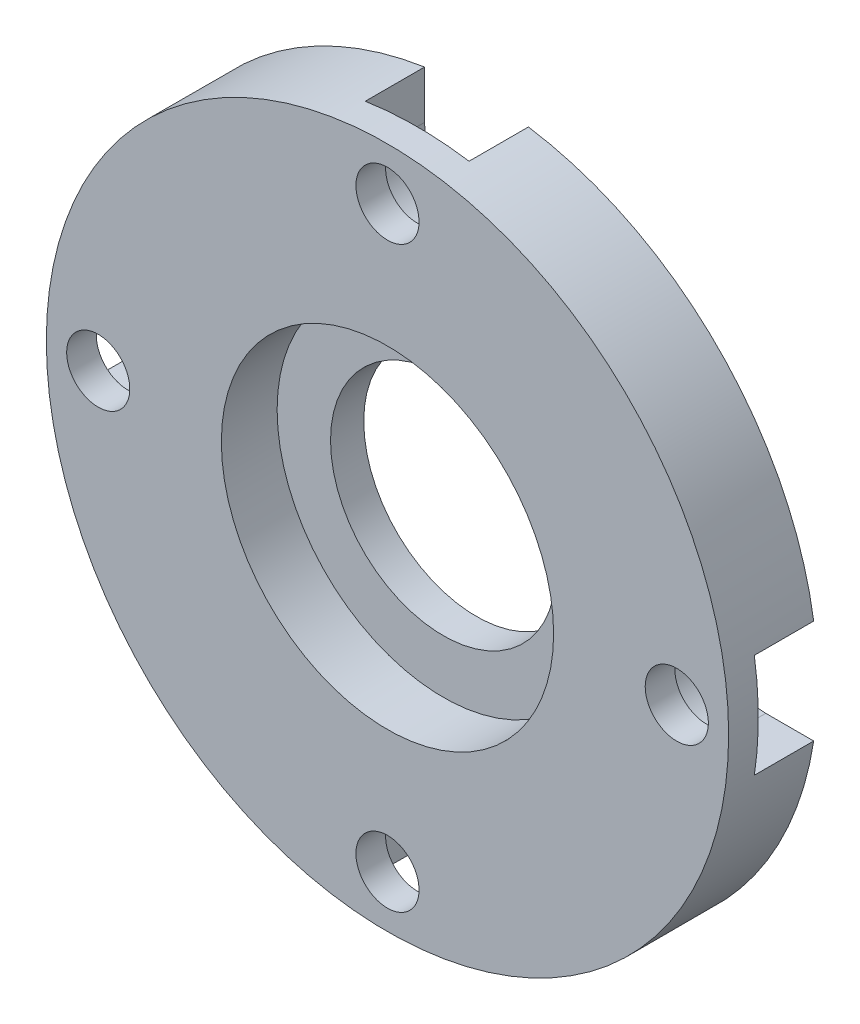
ISO-10303-21;
HEADER;
FILE_DESCRIPTION(('STEP AP214'),'2;1');
FILE_NAME('part.step','',(''),(''),'','','');
FILE_SCHEMA(('AUTOMOTIVE_DESIGN { 1 0 10303 214 1 1 1 1 }'));
ENDSEC;
DATA;
#1=APPLICATION_CONTEXT('core data for automotive mechanical design processes');
#2=APPLICATION_PROTOCOL_DEFINITION('international standard','automotive_design',2000,#1);
#3=PRODUCT_CONTEXT('',#1,'mechanical');
#4=PRODUCT('Part','Part','',(#3));
#5=PRODUCT_RELATED_PRODUCT_CATEGORY('part','',(#4));
#6=PRODUCT_DEFINITION_FORMATION('','',#4);
#7=PRODUCT_DEFINITION_CONTEXT('part definition',#1,'design');
#8=PRODUCT_DEFINITION('design','',#6,#7);
#9=PRODUCT_DEFINITION_SHAPE('','',#8);
#10=(LENGTH_UNIT() NAMED_UNIT(*) SI_UNIT(.MILLI.,.METRE.));
#11=(NAMED_UNIT(*) PLANE_ANGLE_UNIT() SI_UNIT($,.RADIAN.));
#12=(NAMED_UNIT(*) SI_UNIT($,.STERADIAN.) SOLID_ANGLE_UNIT());
#13=UNCERTAINTY_MEASURE_WITH_UNIT(LENGTH_MEASURE(1.E-05),#10,'distance_accuracy_value','');
#14=(GEOMETRIC_REPRESENTATION_CONTEXT(3) GLOBAL_UNCERTAINTY_ASSIGNED_CONTEXT((#13)) GLOBAL_UNIT_ASSIGNED_CONTEXT((#10,
#11,#12)) REPRESENTATION_CONTEXT('',''));
#15=CARTESIAN_POINT('',(0.,0.,0.));
#16=DIRECTION('',(0.,0.,1.));
#17=DIRECTION('',(1.,0.,0.));
#18=AXIS2_PLACEMENT_3D('',#15,#16,#17);
#19=CARTESIAN_POINT('',(30.95752,0.,-93.345));
#20=DIRECTION('',(0.,0.,-1.));
#21=DIRECTION('',(-1.,0.,0.));
#22=AXIS2_PLACEMENT_3D('',#19,#20,#21);
#23=CYLINDRICAL_SURFACE('',#22,5.55625);
#24=DIRECTION('',(0.,0.,-1.));
#25=VECTOR('',#24,1.);
#26=CARTESIAN_POINT('',(30.9575199999996,-5.55625000000041,-74.1961658245761));
#27=LINE('',#26,#25);
#28=CARTESIAN_POINT('',(30.9575199999996,-5.55625000000041,-86.995));
#29=VERTEX_POINT('',#28);
#30=CARTESIAN_POINT('',(30.9575199999996,-5.55625,-93.345));
#31=VERTEX_POINT('',#30);
#32=EDGE_CURVE('E278',#29,#31,#27,.T.);
#33=ORIENTED_EDGE('',*,*,#32,.T.);
#34=CARTESIAN_POINT('',(30.95752,0.,-93.345));
#35=DIRECTION('',(0.,0.,-1.));
#36=DIRECTION('',(-1.,0.,0.));
#37=AXIS2_PLACEMENT_3D('',#34,#35,#36);
#38=CIRCLE('',#37,5.55625);
#39=CARTESIAN_POINT('',(30.9575199999996,5.55624999999954,-93.345));
#40=VERTEX_POINT('',#39);
#41=EDGE_CURVE('E211',#31,#40,#38,.T.);
#42=ORIENTED_EDGE('',*,*,#41,.T.);
#43=DIRECTION('',(0.,0.,-1.));
#44=VECTOR('',#43,1.);
#45=CARTESIAN_POINT('',(30.9575199999996,5.55624999999954,-74.1961658245761));
#46=LINE('',#45,#44);
#47=CARTESIAN_POINT('',(30.9575199999996,5.55625,-86.995));
#48=VERTEX_POINT('',#47);
#49=EDGE_CURVE('E276',#48,#40,#46,.T.);
#50=ORIENTED_EDGE('',*,*,#49,.F.);
#51=CARTESIAN_POINT('',(30.95752,0.,-86.995));
#52=DIRECTION('',(0.,0.,-1.));
#53=DIRECTION('',(-1.,0.,0.));
#54=AXIS2_PLACEMENT_3D('',#51,#52,#53);
#55=CIRCLE('',#54,5.55625);
#56=EDGE_CURVE('E214',#29,#48,#55,.T.);
#57=ORIENTED_EDGE('',*,*,#56,.F.);
#58=EDGE_LOOP('',(#33,#42,#50,#57));
#59=FACE_BOUND('',#58,.T.);
#60=ADVANCED_FACE('F33',(#59),#23,.F.);
#61=CARTESIAN_POINT('',(0.,-30.95752,-93.345));
#62=DIRECTION('',(0.,0.,-1.));
#63=DIRECTION('',(-1.,0.,0.));
#64=AXIS2_PLACEMENT_3D('',#61,#62,#63);
#65=CYLINDRICAL_SURFACE('',#64,5.55625);
#66=DIRECTION('',(0.,0.,-1.));
#67=VECTOR('',#66,1.);
#68=CARTESIAN_POINT('',(-5.55625000000084,-30.95752,-74.1961658245761));
#69=LINE('',#68,#67);
#70=CARTESIAN_POINT('',(-5.55625000000084,-30.95752,-86.995));
#71=VERTEX_POINT('',#70);
#72=CARTESIAN_POINT('',(-5.55625,-30.95752,-93.345));
#73=VERTEX_POINT('',#72);
#74=EDGE_CURVE('E255',#71,#73,#69,.T.);
#75=ORIENTED_EDGE('',*,*,#74,.T.);
#76=CARTESIAN_POINT('',(0.,-30.95752,-93.345));
#77=DIRECTION('',(0.,0.,-1.));
#78=DIRECTION('',(-1.,0.,0.));
#79=AXIS2_PLACEMENT_3D('',#76,#77,#78);
#80=CIRCLE('',#79,5.55625);
#81=CARTESIAN_POINT('',(5.55624999999911,-30.95752,-93.345));
#82=VERTEX_POINT('',#81);
#83=EDGE_CURVE('E177',#73,#82,#80,.T.);
#84=ORIENTED_EDGE('',*,*,#83,.T.);
#85=DIRECTION('',(0.,0.,-1.));
#86=VECTOR('',#85,1.);
#87=CARTESIAN_POINT('',(5.55624999999911,-30.95752,-74.1961658245761));
#88=LINE('',#87,#86);
#89=CARTESIAN_POINT('',(5.55625,-30.95752,-86.995));
#90=VERTEX_POINT('',#89);
#91=EDGE_CURVE('E253',#90,#82,#88,.T.);
#92=ORIENTED_EDGE('',*,*,#91,.F.);
#93=CARTESIAN_POINT('',(0.,-30.95752,-86.995));
#94=DIRECTION('',(0.,0.,-1.));
#95=DIRECTION('',(-1.,0.,0.));
#96=AXIS2_PLACEMENT_3D('',#93,#94,#95);
#97=CIRCLE('',#96,5.55625);
#98=EDGE_CURVE('E202',#71,#90,#97,.T.);
#99=ORIENTED_EDGE('',*,*,#98,.F.);
#100=EDGE_LOOP('',(#75,#84,#92,#99));
#101=FACE_BOUND('',#100,.T.);
#102=ADVANCED_FACE('F251',(#101),#65,.F.);
#103=CARTESIAN_POINT('',(-30.95752,0.,-93.345));
#104=DIRECTION('',(0.,0.,-1.));
#105=DIRECTION('',(-1.,0.,0.));
#106=AXIS2_PLACEMENT_3D('',#103,#104,#105);
#107=CYLINDRICAL_SURFACE('',#106,5.55625);
#108=DIRECTION('',(0.,0.,-1.));
#109=VECTOR('',#108,1.);
#110=CARTESIAN_POINT('',(-30.95752,5.55624999999987,-74.1961658245761));
#111=LINE('',#110,#109);
#112=CARTESIAN_POINT('',(-30.95752,5.55624999999987,-86.995));
#113=VERTEX_POINT('',#112);
#114=CARTESIAN_POINT('',(-30.95752,5.55625,-93.345));
#115=VERTEX_POINT('',#114);
#116=EDGE_CURVE('E269',#113,#115,#111,.T.);
#117=ORIENTED_EDGE('',*,*,#116,.T.);
#118=CARTESIAN_POINT('',(-30.95752,0.,-93.345));
#119=DIRECTION('',(0.,0.,-1.));
#120=DIRECTION('',(-1.,0.,0.));
#121=AXIS2_PLACEMENT_3D('',#118,#119,#120);
#122=CIRCLE('',#121,5.55625);
#123=CARTESIAN_POINT('',(-30.95752,-5.55625000000008,-93.345));
#124=VERTEX_POINT('',#123);
#125=EDGE_CURVE('E190',#115,#124,#122,.T.);
#126=ORIENTED_EDGE('',*,*,#125,.T.);
#127=DIRECTION('',(0.,0.,-1.));
#128=VECTOR('',#127,1.);
#129=CARTESIAN_POINT('',(-30.95752,-5.55625000000008,-74.1961658245761));
#130=LINE('',#129,#128);
#131=CARTESIAN_POINT('',(-30.95752,-5.55625,-86.995));
#132=VERTEX_POINT('',#131);
#133=EDGE_CURVE('E267',#132,#124,#130,.T.);
#134=ORIENTED_EDGE('',*,*,#133,.F.);
#135=CARTESIAN_POINT('',(-30.95752,0.,-86.995));
#136=DIRECTION('',(0.,0.,-1.));
#137=DIRECTION('',(-1.,0.,0.));
#138=AXIS2_PLACEMENT_3D('',#135,#136,#137);
#139=CIRCLE('',#138,5.55625);
#140=EDGE_CURVE('E193',#113,#132,#139,.T.);
#141=ORIENTED_EDGE('',*,*,#140,.F.);
#142=EDGE_LOOP('',(#117,#126,#134,#141));
#143=FACE_BOUND('',#142,.T.);
#144=ADVANCED_FACE('F361',(#143),#107,.F.);
#145=CARTESIAN_POINT('',(0.,0.,-141.552259200278));
#146=DIRECTION('',(0.,0.,-1.));
#147=DIRECTION('',(-1.,0.,0.));
#148=AXIS2_PLACEMENT_3D('',#145,#146,#147);
#149=CYLINDRICAL_SURFACE('',#148,12.0649999999755);
#150=CARTESIAN_POINT('',(0.,0.,-89.789));
#151=DIRECTION('',(0.,0.,-1.));
#152=DIRECTION('',(-1.,0.,0.));
#153=AXIS2_PLACEMENT_3D('',#150,#151,#152);
#154=CIRCLE('',#153,12.0649999999755);
#155=CARTESIAN_POINT('',(-12.0649999999755,0.,-89.789));
#156=VERTEX_POINT('',#155);
#157=EDGE_CURVE('E239',#156,#156,#154,.T.);
#158=ORIENTED_EDGE('',*,*,#157,.F.);
#159=EDGE_LOOP('',(#158));
#160=FACE_BOUND('',#159,.T.);
#161=CARTESIAN_POINT('',(0.,0.,-93.345));
#162=DIRECTION('',(0.,0.,-1.));
#163=DIRECTION('',(-1.,0.,0.));
#164=AXIS2_PLACEMENT_3D('',#161,#162,#163);
#165=CIRCLE('',#164,12.0649999999755);
#166=CARTESIAN_POINT('',(-12.0649999999755,0.,-93.345));
#167=VERTEX_POINT('',#166);
#168=EDGE_CURVE('E223',#167,#167,#165,.T.);
#169=ORIENTED_EDGE('',*,*,#168,.T.);
#170=EDGE_LOOP('',(#169));
#171=FACE_BOUND('',#170,.T.);
#172=ADVANCED_FACE('F35',(#160,#171),#149,.F.);
#173=CARTESIAN_POINT('',(0.,12.0649999999755,-89.789));
#174=DIRECTION('',(0.,0.,-1.));
#175=DIRECTION('',(-1.,0.,0.));
#176=AXIS2_PLACEMENT_3D('',#173,#174,#175);
#177=PLANE('',#176);
#178=CARTESIAN_POINT('',(0.,0.,-89.789));
#179=DIRECTION('',(0.,0.,-1.));
#180=DIRECTION('',(-1.,0.,0.));
#181=AXIS2_PLACEMENT_3D('',#178,#179,#180);
#182=CIRCLE('',#181,17.7799999999755);
#183=CARTESIAN_POINT('',(-17.7799999999755,0.,-89.789));
#184=VERTEX_POINT('',#183);
#185=EDGE_CURVE('E236',#184,#184,#182,.T.);
#186=ORIENTED_EDGE('',*,*,#185,.F.);
#187=EDGE_LOOP('',(#186));
#188=FACE_BOUND('',#187,.T.);
#189=ORIENTED_EDGE('',*,*,#157,.T.);
#190=EDGE_LOOP('',(#189));
#191=FACE_BOUND('',#190,.T.);
#192=ADVANCED_FACE('F384',(#188,#191),#177,.F.);
#193=CARTESIAN_POINT('',(0.,0.,-141.552259200278));
#194=DIRECTION('',(0.,0.,-1.));
#195=DIRECTION('',(-1.,0.,0.));
#196=AXIS2_PLACEMENT_3D('',#193,#194,#195);
#197=CYLINDRICAL_SURFACE('',#196,17.7799999999755);
#198=CARTESIAN_POINT('',(0.,0.,-83.82));
#199=DIRECTION('',(0.,0.,-1.));
#200=DIRECTION('',(-1.,0.,0.));
#201=AXIS2_PLACEMENT_3D('',#198,#199,#200);
#202=CIRCLE('',#201,17.7799999999755);
#203=CARTESIAN_POINT('',(-17.7799999999755,0.,-83.82));
#204=VERTEX_POINT('',#203);
#205=EDGE_CURVE('E232',#204,#204,#202,.T.);
#206=ORIENTED_EDGE('',*,*,#205,.F.);
#207=EDGE_LOOP('',(#206));
#208=FACE_BOUND('',#207,.T.);
#209=ORIENTED_EDGE('',*,*,#185,.T.);
#210=EDGE_LOOP('',(#209));
#211=FACE_BOUND('',#210,.T.);
#212=ADVANCED_FACE('F381',(#208,#211),#197,.F.);
#213=CARTESIAN_POINT('',(0.,36.5125,-83.82));
#214=DIRECTION('',(0.,0.,1.));
#215=DIRECTION('',(1.,0.,0.));
#216=AXIS2_PLACEMENT_3D('',#213,#214,#215);
#217=PLANE('',#216);
#218=CARTESIAN_POINT('',(0.,30.95752,-83.82));
#219=DIRECTION('',(0.,0.,-1.));
#220=DIRECTION('',(-1.,0.,0.));
#221=AXIS2_PLACEMENT_3D('',#218,#219,#220);
#222=CIRCLE('',#221,3.3782);
#223=CARTESIAN_POINT('',(-3.3782,30.95752,-83.82));
#224=VERTEX_POINT('',#223);
#225=EDGE_CURVE('E187',#224,#224,#222,.T.);
#226=ORIENTED_EDGE('',*,*,#225,.T.);
#227=EDGE_LOOP('',(#226));
#228=FACE_BOUND('',#227,.T.);
#229=CARTESIAN_POINT('',(-30.95752,0.,-83.82));
#230=DIRECTION('',(0.,0.,-1.));
#231=DIRECTION('',(-1.,0.,0.));
#232=AXIS2_PLACEMENT_3D('',#229,#230,#231);
#233=CIRCLE('',#232,3.3782);
#234=CARTESIAN_POINT('',(-34.33572,0.,-83.82));
#235=VERTEX_POINT('',#234);
#236=EDGE_CURVE('E199',#235,#235,#233,.T.);
#237=ORIENTED_EDGE('',*,*,#236,.T.);
#238=EDGE_LOOP('',(#237));
#239=FACE_BOUND('',#238,.T.);
#240=CARTESIAN_POINT('',(0.,-30.95752,-83.82));
#241=DIRECTION('',(0.,0.,-1.));
#242=DIRECTION('',(-1.,0.,0.));
#243=AXIS2_PLACEMENT_3D('',#240,#241,#242);
#244=CIRCLE('',#243,3.3782);
#245=CARTESIAN_POINT('',(-3.3782,-30.95752,-83.82));
#246=VERTEX_POINT('',#245);
#247=EDGE_CURVE('E208',#246,#246,#244,.T.);
#248=ORIENTED_EDGE('',*,*,#247,.T.);
#249=EDGE_LOOP('',(#248));
#250=FACE_BOUND('',#249,.T.);
#251=CARTESIAN_POINT('',(30.95752,0.,-83.82));
#252=DIRECTION('',(0.,0.,-1.));
#253=DIRECTION('',(-1.,0.,0.));
#254=AXIS2_PLACEMENT_3D('',#251,#252,#253);
#255=CIRCLE('',#254,3.3782);
#256=CARTESIAN_POINT('',(27.57932,0.,-83.82));
#257=VERTEX_POINT('',#256);
#258=EDGE_CURVE('E220',#257,#257,#255,.T.);
#259=ORIENTED_EDGE('',*,*,#258,.T.);
#260=EDGE_LOOP('',(#259));
#261=FACE_BOUND('',#260,.T.);
#262=ORIENTED_EDGE('',*,*,#205,.T.);
#263=EDGE_LOOP('',(#262));
#264=FACE_BOUND('',#263,.T.);
#265=CARTESIAN_POINT('',(0.,0.,-83.82));
#266=DIRECTION('',(0.,0.,-1.));
#267=DIRECTION('',(-1.,0.,0.));
#268=AXIS2_PLACEMENT_3D('',#265,#266,#267);
#269=CIRCLE('',#268,36.5125);
#270=CARTESIAN_POINT('',(-36.5125,0.,-83.82));
#271=VERTEX_POINT('',#270);
#272=EDGE_CURVE('E229',#271,#271,#269,.T.);
#273=ORIENTED_EDGE('',*,*,#272,.F.);
#274=EDGE_LOOP('',(#273));
#275=FACE_BOUND('',#274,.T.);
#276=ADVANCED_FACE('F378',(#228,#239,#250,#261,#264,#275),#217,.T.);
#277=CARTESIAN_POINT('',(0.,0.,-141.552259200278));
#278=DIRECTION('',(0.,0.,-1.));
#279=DIRECTION('',(-1.,0.,0.));
#280=AXIS2_PLACEMENT_3D('',#277,#278,#279);
#281=CYLINDRICAL_SURFACE('',#280,36.5125);
#282=DIRECTION('',(0.,0.,-1.));
#283=VECTOR('',#282,1.);
#284=CARTESIAN_POINT('',(5.55624999999997,36.0872656513,-141.552259200278));
#285=LINE('',#284,#283);
#286=CARTESIAN_POINT('',(5.55624999999997,36.0872656513,-86.995));
#287=VERTEX_POINT('',#286);
#288=CARTESIAN_POINT('',(5.55624999999997,36.0872656513,-93.345));
#289=VERTEX_POINT('',#288);
#290=EDGE_CURVE('E288',#287,#289,#285,.T.);
#291=ORIENTED_EDGE('',*,*,#290,.F.);
#292=CARTESIAN_POINT('',(0.,0.,-86.995));
#293=DIRECTION('',(0.,0.,1.));
#294=DIRECTION('',(1.,0.,0.));
#295=AXIS2_PLACEMENT_3D('',#292,#293,#294);
#296=CIRCLE('',#295,36.5125);
#297=CARTESIAN_POINT('',(-5.55624999999997,36.0872656513,-86.995));
#298=VERTEX_POINT('',#297);
#299=EDGE_CURVE('E11',#298,#287,#296,.F.);
#300=ORIENTED_EDGE('',*,*,#299,.F.);
#301=DIRECTION('',(0.,0.,-1.));
#302=VECTOR('',#301,1.);
#303=CARTESIAN_POINT('',(-5.55624999999997,36.0872656513,-141.552259200278));
#304=LINE('',#303,#302);
#305=CARTESIAN_POINT('',(-5.55624999999997,36.0872656513,-93.345));
#306=VERTEX_POINT('',#305);
#307=EDGE_CURVE('E286',#306,#298,#304,.F.);
#308=ORIENTED_EDGE('',*,*,#307,.F.);
#309=CARTESIAN_POINT('',(0.,0.,-93.345));
#310=DIRECTION('',(0.,0.,-1.));
#311=DIRECTION('',(-1.,0.,0.));
#312=AXIS2_PLACEMENT_3D('',#309,#310,#311);
#313=CIRCLE('',#312,36.5125);
#314=CARTESIAN_POINT('',(-36.0872656513001,5.55624999999985,-93.345));
#315=VERTEX_POINT('',#314);
#316=EDGE_CURVE('E168',#315,#306,#313,.T.);
#317=ORIENTED_EDGE('',*,*,#316,.F.);
#318=DIRECTION('',(0.,0.,-1.));
#319=VECTOR('',#318,1.);
#320=CARTESIAN_POINT('',(-36.0872656513001,5.55624999999985,-141.552259200278));
#321=LINE('',#320,#319);
#322=CARTESIAN_POINT('',(-36.0872656513001,5.55624999999985,-86.995));
#323=VERTEX_POINT('',#322);
#324=EDGE_CURVE('E290',#323,#315,#321,.T.);
#325=ORIENTED_EDGE('',*,*,#324,.F.);
#326=CARTESIAN_POINT('',(0.,0.,-86.995));
#327=DIRECTION('',(0.,0.,1.));
#328=DIRECTION('',(1.,0.,0.));
#329=AXIS2_PLACEMENT_3D('',#326,#327,#328);
#330=CIRCLE('',#329,36.5125);
#331=CARTESIAN_POINT('',(-36.0872656513,-5.5562500000001,-86.995));
#332=VERTEX_POINT('',#331);
#333=EDGE_CURVE('E175',#332,#323,#330,.F.);
#334=ORIENTED_EDGE('',*,*,#333,.F.);
#335=DIRECTION('',(0.,0.,-1.));
#336=VECTOR('',#335,1.);
#337=CARTESIAN_POINT('',(-36.0872656513,-5.5562500000001,-141.552259200278));
#338=LINE('',#337,#336);
#339=CARTESIAN_POINT('',(-36.0872656513,-5.5562500000001,-93.345));
#340=VERTEX_POINT('',#339);
#341=EDGE_CURVE('E292',#340,#332,#338,.F.);
#342=ORIENTED_EDGE('',*,*,#341,.F.);
#343=CARTESIAN_POINT('',(-5.55625000000085,-36.0872656512999,-93.345));
#344=VERTEX_POINT('',#343);
#345=EDGE_CURVE('E228',#344,#340,#313,.T.);
#346=ORIENTED_EDGE('',*,*,#345,.F.);
#347=DIRECTION('',(0.,0.,-1.));
#348=VECTOR('',#347,1.);
#349=CARTESIAN_POINT('',(-5.55625000000085,-36.0872656512999,-141.552259200278));
#350=LINE('',#349,#348);
#351=CARTESIAN_POINT('',(-5.55625000000085,-36.0872656512999,-86.995));
#352=VERTEX_POINT('',#351);
#353=EDGE_CURVE('E295',#352,#344,#350,.T.);
#354=ORIENTED_EDGE('',*,*,#353,.F.);
#355=CARTESIAN_POINT('',(0.,0.,-86.995));
#356=DIRECTION('',(0.,0.,1.));
#357=DIRECTION('',(1.,0.,0.));
#358=AXIS2_PLACEMENT_3D('',#355,#356,#357);
#359=CIRCLE('',#358,36.5125);
#360=CARTESIAN_POINT('',(5.55624999999911,-36.0872656513002,-86.995));
#361=VERTEX_POINT('',#360);
#362=EDGE_CURVE('E244',#361,#352,#359,.F.);
#363=ORIENTED_EDGE('',*,*,#362,.F.);
#364=DIRECTION('',(0.,0.,-1.));
#365=VECTOR('',#364,1.);
#366=CARTESIAN_POINT('',(5.55624999999911,-36.0872656513002,-141.552259200278));
#367=LINE('',#366,#365);
#368=CARTESIAN_POINT('',(5.55624999999911,-36.0872656513002,-93.345));
#369=VERTEX_POINT('',#368);
#370=EDGE_CURVE('E297',#369,#361,#367,.F.);
#371=ORIENTED_EDGE('',*,*,#370,.F.);
#372=CARTESIAN_POINT('',(36.0872656513,-5.55625000000042,-93.345));
#373=VERTEX_POINT('',#372);
#374=EDGE_CURVE('E233',#373,#369,#313,.T.);
#375=ORIENTED_EDGE('',*,*,#374,.F.);
#376=DIRECTION('',(0.,0.,-1.));
#377=VECTOR('',#376,1.);
#378=CARTESIAN_POINT('',(36.0872656513,-5.55625000000042,-141.552259200278));
#379=LINE('',#378,#377);
#380=CARTESIAN_POINT('',(36.0872656513,-5.55625000000042,-86.995));
#381=VERTEX_POINT('',#380);
#382=EDGE_CURVE('E298',#381,#373,#379,.T.);
#383=ORIENTED_EDGE('',*,*,#382,.F.);
#384=CARTESIAN_POINT('',(0.,0.,-86.995));
#385=DIRECTION('',(0.,0.,1.));
#386=DIRECTION('',(1.,0.,0.));
#387=AXIS2_PLACEMENT_3D('',#384,#385,#386);
#388=CIRCLE('',#387,36.5125);
#389=CARTESIAN_POINT('',(36.0872656513001,5.55624999999954,-86.995));
#390=VERTEX_POINT('',#389);
#391=EDGE_CURVE('E242',#390,#381,#388,.F.);
#392=ORIENTED_EDGE('',*,*,#391,.F.);
#393=DIRECTION('',(0.,0.,-1.));
#394=VECTOR('',#393,1.);
#395=CARTESIAN_POINT('',(36.0872656513001,5.55624999999954,-141.552259200278));
#396=LINE('',#395,#394);
#397=CARTESIAN_POINT('',(36.0872656513001,5.55624999999954,-93.345));
#398=VERTEX_POINT('',#397);
#399=EDGE_CURVE('E180',#398,#390,#396,.F.);
#400=ORIENTED_EDGE('',*,*,#399,.F.);
#401=EDGE_CURVE('E226',#289,#398,#313,.T.);
#402=ORIENTED_EDGE('',*,*,#401,.F.);
#403=EDGE_LOOP('',(#291,#300,#308,#317,#325,#334,#342,#346,#354,#363,#371,#375,#383,#392,#400,#402));
#404=FACE_BOUND('',#403,.T.);
#405=ORIENTED_EDGE('',*,*,#272,.T.);
#406=EDGE_LOOP('',(#405));
#407=FACE_BOUND('',#406,.T.);
#408=ADVANCED_FACE('F317',(#404,#407),#281,.T.);
#409=CARTESIAN_POINT('',(0.,12.0649999999755,-93.345));
#410=DIRECTION('',(0.,0.,-1.));
#411=DIRECTION('',(-1.,0.,0.));
#412=AXIS2_PLACEMENT_3D('',#409,#410,#411);
#413=PLANE('',#412);
#414=DIRECTION('',(0.,-1.,0.));
#415=VECTOR('',#414,1.);
#416=CARTESIAN_POINT('',(5.55624999999997,37.30752,-93.345));
#417=LINE('',#416,#415);
#418=CARTESIAN_POINT('',(5.55625,30.95752,-93.345));
#419=VERTEX_POINT('',#418);
#420=EDGE_CURVE('E169',#289,#419,#417,.T.);
#421=ORIENTED_EDGE('',*,*,#420,.F.);
#422=ORIENTED_EDGE('',*,*,#401,.T.);
#423=DIRECTION('',(1.,0.,0.));
#424=VECTOR('',#423,1.);
#425=CARTESIAN_POINT('',(30.9575199999996,5.55624999999954,-93.345));
#426=LINE('',#425,#424);
#427=EDGE_CURVE('E283',#40,#398,#426,.T.);
#428=ORIENTED_EDGE('',*,*,#427,.F.);
#429=ORIENTED_EDGE('',*,*,#41,.F.);
#430=DIRECTION('',(-1.,0.,0.));
#431=VECTOR('',#430,1.);
#432=CARTESIAN_POINT('',(37.3075199999996,-5.55625000000042,-93.345));
#433=LINE('',#432,#431);
#434=EDGE_CURVE('E56',#373,#31,#433,.T.);
#435=ORIENTED_EDGE('',*,*,#434,.F.);
#436=ORIENTED_EDGE('',*,*,#374,.T.);
#437=DIRECTION('',(0.,-1.,0.));
#438=VECTOR('',#437,1.);
#439=CARTESIAN_POINT('',(5.55624999999911,-30.95752,-93.345));
#440=LINE('',#439,#438);
#441=EDGE_CURVE('E262',#82,#369,#440,.T.);
#442=ORIENTED_EDGE('',*,*,#441,.F.);
#443=ORIENTED_EDGE('',*,*,#83,.F.);
#444=DIRECTION('',(0.,1.,0.));
#445=VECTOR('',#444,1.);
#446=CARTESIAN_POINT('',(-5.55625000000085,-37.30752,-93.345));
#447=LINE('',#446,#445);
#448=EDGE_CURVE('E259',#344,#73,#447,.T.);
#449=ORIENTED_EDGE('',*,*,#448,.F.);
#450=ORIENTED_EDGE('',*,*,#345,.T.);
#451=DIRECTION('',(-1.,0.,0.));
#452=VECTOR('',#451,1.);
#453=CARTESIAN_POINT('',(-30.95752,-5.55625000000008,-93.345));
#454=LINE('',#453,#452);
#455=EDGE_CURVE('E170',#124,#340,#454,.T.);
#456=ORIENTED_EDGE('',*,*,#455,.F.);
#457=ORIENTED_EDGE('',*,*,#125,.F.);
#458=DIRECTION('',(1.,0.,0.));
#459=VECTOR('',#458,1.);
#460=CARTESIAN_POINT('',(-37.30752,5.55624999999984,-93.345));
#461=LINE('',#460,#459);
#462=EDGE_CURVE('E329',#315,#115,#461,.T.);
#463=ORIENTED_EDGE('',*,*,#462,.F.);
#464=ORIENTED_EDGE('',*,*,#316,.T.);
#465=DIRECTION('',(0.,1.,0.));
#466=VECTOR('',#465,1.);
#467=CARTESIAN_POINT('',(-5.55624999999997,30.95752,-93.345));
#468=LINE('',#467,#466);
#469=CARTESIAN_POINT('',(-5.55624999999997,30.95752,-93.345));
#470=VERTEX_POINT('',#469);
#471=EDGE_CURVE('E150',#470,#306,#468,.T.);
#472=ORIENTED_EDGE('',*,*,#471,.F.);
#473=CARTESIAN_POINT('',(0.,30.95752,-93.345));
#474=DIRECTION('',(0.,0.,-1.));
#475=DIRECTION('',(-1.,0.,0.));
#476=AXIS2_PLACEMENT_3D('',#473,#474,#475);
#477=CIRCLE('',#476,5.55625);
#478=EDGE_CURVE('E41',#419,#470,#477,.T.);
#479=ORIENTED_EDGE('',*,*,#478,.F.);
#480=EDGE_LOOP('',(#421,#422,#428,#429,#435,#436,#442,#443,#449,#450,#456,#457,#463,#464,#472,#479));
#481=FACE_BOUND('',#480,.T.);
#482=ORIENTED_EDGE('',*,*,#168,.F.);
#483=EDGE_LOOP('',(#482));
#484=FACE_BOUND('',#483,.T.);
#485=ADVANCED_FACE('F164',(#481,#484),#413,.T.);
#486=CARTESIAN_POINT('',(30.95752,0.,-93.345));
#487=DIRECTION('',(0.,0.,-1.));
#488=DIRECTION('',(-1.,0.,0.));
#489=AXIS2_PLACEMENT_3D('',#486,#487,#488);
#490=CYLINDRICAL_SURFACE('',#489,3.3782);
#491=ORIENTED_EDGE('',*,*,#258,.F.);
#492=EDGE_LOOP('',(#491));
#493=FACE_BOUND('',#492,.T.);
#494=CARTESIAN_POINT('',(30.95752,0.,-86.995));
#495=DIRECTION('',(0.,0.,-1.));
#496=DIRECTION('',(-1.,0.,0.));
#497=AXIS2_PLACEMENT_3D('',#494,#495,#496);
#498=CIRCLE('',#497,3.3782);
#499=CARTESIAN_POINT('',(27.57932,0.,-86.995));
#500=VERTEX_POINT('',#499);
#501=EDGE_CURVE('E217',#500,#500,#498,.T.);
#502=ORIENTED_EDGE('',*,*,#501,.T.);
#503=EDGE_LOOP('',(#502));
#504=FACE_BOUND('',#503,.T.);
#505=ADVANCED_FACE('F369',(#493,#504),#490,.F.);
#506=CARTESIAN_POINT('',(34.33572,0.,-86.995));
#507=DIRECTION('',(0.,0.,1.));
#508=DIRECTION('',(1.,0.,0.));
#509=AXIS2_PLACEMENT_3D('',#506,#507,#508);
#510=PLANE('',#509);
#511=ORIENTED_EDGE('',*,*,#501,.F.);
#512=EDGE_LOOP('',(#511));
#513=FACE_BOUND('',#512,.T.);
#514=ORIENTED_EDGE('',*,*,#391,.T.);
#515=DIRECTION('',(-1.,0.,0.));
#516=VECTOR('',#515,1.);
#517=CARTESIAN_POINT('',(37.3075199999996,-5.55625000000042,-86.995));
#518=LINE('',#517,#516);
#519=EDGE_CURVE('E280',#381,#29,#518,.T.);
#520=ORIENTED_EDGE('',*,*,#519,.T.);
#521=ORIENTED_EDGE('',*,*,#56,.T.);
#522=DIRECTION('',(1.,0.,0.));
#523=VECTOR('',#522,1.);
#524=CARTESIAN_POINT('',(30.9575199999996,5.55624999999954,-86.995));
#525=LINE('',#524,#523);
#526=EDGE_CURVE('E48',#48,#390,#525,.T.);
#527=ORIENTED_EDGE('',*,*,#526,.T.);
#528=EDGE_LOOP('',(#514,#520,#521,#527));
#529=FACE_BOUND('',#528,.T.);
#530=ADVANCED_FACE('F308',(#513,#529),#510,.F.);
#531=CARTESIAN_POINT('',(0.,-30.95752,-93.345));
#532=DIRECTION('',(0.,0.,-1.));
#533=DIRECTION('',(-1.,0.,0.));
#534=AXIS2_PLACEMENT_3D('',#531,#532,#533);
#535=CYLINDRICAL_SURFACE('',#534,3.3782);
#536=ORIENTED_EDGE('',*,*,#247,.F.);
#537=EDGE_LOOP('',(#536));
#538=FACE_BOUND('',#537,.T.);
#539=CARTESIAN_POINT('',(0.,-30.95752,-86.995));
#540=DIRECTION('',(0.,0.,-1.));
#541=DIRECTION('',(-1.,0.,0.));
#542=AXIS2_PLACEMENT_3D('',#539,#540,#541);
#543=CIRCLE('',#542,3.3782);
#544=CARTESIAN_POINT('',(-3.3782,-30.95752,-86.995));
#545=VERTEX_POINT('',#544);
#546=EDGE_CURVE('E205',#545,#545,#543,.T.);
#547=ORIENTED_EDGE('',*,*,#546,.T.);
#548=EDGE_LOOP('',(#547));
#549=FACE_BOUND('',#548,.T.);
#550=ADVANCED_FACE('F365',(#538,#549),#535,.F.);
#551=CARTESIAN_POINT('',(3.3782,-30.95752,-86.995));
#552=DIRECTION('',(0.,0.,1.));
#553=DIRECTION('',(1.,0.,0.));
#554=AXIS2_PLACEMENT_3D('',#551,#552,#553);
#555=PLANE('',#554);
#556=ORIENTED_EDGE('',*,*,#546,.F.);
#557=EDGE_LOOP('',(#556));
#558=FACE_BOUND('',#557,.T.);
#559=ORIENTED_EDGE('',*,*,#362,.T.);
#560=DIRECTION('',(0.,1.,0.));
#561=VECTOR('',#560,1.);
#562=CARTESIAN_POINT('',(-5.55625000000085,-37.30752,-86.995));
#563=LINE('',#562,#561);
#564=EDGE_CURVE('E338',#352,#71,#563,.T.);
#565=ORIENTED_EDGE('',*,*,#564,.T.);
#566=ORIENTED_EDGE('',*,*,#98,.T.);
#567=DIRECTION('',(0.,-1.,0.));
#568=VECTOR('',#567,1.);
#569=CARTESIAN_POINT('',(5.55624999999911,-30.95752,-86.995));
#570=LINE('',#569,#568);
#571=EDGE_CURVE('E271',#90,#361,#570,.T.);
#572=ORIENTED_EDGE('',*,*,#571,.T.);
#573=EDGE_LOOP('',(#559,#565,#566,#572));
#574=FACE_BOUND('',#573,.T.);
#575=ADVANCED_FACE('F342',(#558,#574),#555,.F.);
#576=CARTESIAN_POINT('',(-30.95752,0.,-93.345));
#577=DIRECTION('',(0.,0.,-1.));
#578=DIRECTION('',(-1.,0.,0.));
#579=AXIS2_PLACEMENT_3D('',#576,#577,#578);
#580=CYLINDRICAL_SURFACE('',#579,3.3782);
#581=ORIENTED_EDGE('',*,*,#236,.F.);
#582=EDGE_LOOP('',(#581));
#583=FACE_BOUND('',#582,.T.);
#584=CARTESIAN_POINT('',(-30.95752,0.,-86.995));
#585=DIRECTION('',(0.,0.,-1.));
#586=DIRECTION('',(-1.,0.,0.));
#587=AXIS2_PLACEMENT_3D('',#584,#585,#586);
#588=CIRCLE('',#587,3.3782);
#589=CARTESIAN_POINT('',(-34.33572,0.,-86.995));
#590=VERTEX_POINT('',#589);
#591=EDGE_CURVE('E196',#590,#590,#588,.T.);
#592=ORIENTED_EDGE('',*,*,#591,.T.);
#593=EDGE_LOOP('',(#592));
#594=FACE_BOUND('',#593,.T.);
#595=ADVANCED_FACE('F412',(#583,#594),#580,.F.);
#596=CARTESIAN_POINT('',(-27.57932,0.,-86.995));
#597=DIRECTION('',(0.,0.,1.));
#598=DIRECTION('',(1.,0.,0.));
#599=AXIS2_PLACEMENT_3D('',#596,#597,#598);
#600=PLANE('',#599);
#601=ORIENTED_EDGE('',*,*,#591,.F.);
#602=EDGE_LOOP('',(#601));
#603=FACE_BOUND('',#602,.T.);
#604=ORIENTED_EDGE('',*,*,#333,.T.);
#605=DIRECTION('',(1.,0.,0.));
#606=VECTOR('',#605,1.);
#607=CARTESIAN_POINT('',(-37.30752,5.55624999999984,-86.995));
#608=LINE('',#607,#606);
#609=EDGE_CURVE('E330',#323,#113,#608,.T.);
#610=ORIENTED_EDGE('',*,*,#609,.T.);
#611=ORIENTED_EDGE('',*,*,#140,.T.);
#612=DIRECTION('',(-1.,0.,0.));
#613=VECTOR('',#612,1.);
#614=CARTESIAN_POINT('',(-30.95752,-5.55625000000008,-86.995));
#615=LINE('',#614,#613);
#616=EDGE_CURVE('E323',#132,#332,#615,.T.);
#617=ORIENTED_EDGE('',*,*,#616,.T.);
#618=EDGE_LOOP('',(#604,#610,#611,#617));
#619=FACE_BOUND('',#618,.T.);
#620=ADVANCED_FACE('F326',(#603,#619),#600,.F.);
#621=CARTESIAN_POINT('',(0.,30.95752,-93.345));
#622=DIRECTION('',(0.,0.,-1.));
#623=DIRECTION('',(-1.,0.,0.));
#624=AXIS2_PLACEMENT_3D('',#621,#622,#623);
#625=CYLINDRICAL_SURFACE('',#624,3.3782);
#626=ORIENTED_EDGE('',*,*,#225,.F.);
#627=EDGE_LOOP('',(#626));
#628=FACE_BOUND('',#627,.T.);
#629=CARTESIAN_POINT('',(0.,30.95752,-86.995));
#630=DIRECTION('',(0.,0.,-1.));
#631=DIRECTION('',(-1.,0.,0.));
#632=AXIS2_PLACEMENT_3D('',#629,#630,#631);
#633=CIRCLE('',#632,3.3782);
#634=CARTESIAN_POINT('',(-3.3782,30.95752,-86.995));
#635=VERTEX_POINT('',#634);
#636=EDGE_CURVE('E184',#635,#635,#633,.T.);
#637=ORIENTED_EDGE('',*,*,#636,.T.);
#638=EDGE_LOOP('',(#637));
#639=FACE_BOUND('',#638,.T.);
#640=ADVANCED_FACE('F408',(#628,#639),#625,.F.);
#641=CARTESIAN_POINT('',(3.3782,30.95752,-86.995));
#642=DIRECTION('',(0.,0.,1.));
#643=DIRECTION('',(1.,0.,0.));
#644=AXIS2_PLACEMENT_3D('',#641,#642,#643);
#645=PLANE('',#644);
#646=ORIENTED_EDGE('',*,*,#636,.F.);
#647=EDGE_LOOP('',(#646));
#648=FACE_BOUND('',#647,.T.);
#649=CARTESIAN_POINT('',(0.,30.95752,-86.995));
#650=DIRECTION('',(0.,0.,-1.));
#651=DIRECTION('',(-1.,0.,0.));
#652=AXIS2_PLACEMENT_3D('',#649,#650,#651);
#653=CIRCLE('',#652,5.55625);
#654=CARTESIAN_POINT('',(5.55624999999998,30.95752,-86.995));
#655=VERTEX_POINT('',#654);
#656=CARTESIAN_POINT('',(-5.55624999999999,30.95752,-86.995));
#657=VERTEX_POINT('',#656);
#658=EDGE_CURVE('E182',#655,#657,#653,.T.);
#659=ORIENTED_EDGE('',*,*,#658,.T.);
#660=DIRECTION('',(0.,1.,0.));
#661=VECTOR('',#660,1.);
#662=CARTESIAN_POINT('',(-5.55624999999997,30.95752,-86.995));
#663=LINE('',#662,#661);
#664=EDGE_CURVE('E153',#657,#298,#663,.T.);
#665=ORIENTED_EDGE('',*,*,#664,.T.);
#666=ORIENTED_EDGE('',*,*,#299,.T.);
#667=DIRECTION('',(0.,-1.,0.));
#668=VECTOR('',#667,1.);
#669=CARTESIAN_POINT('',(5.55624999999997,37.30752,-86.995));
#670=LINE('',#669,#668);
#671=EDGE_CURVE('E605',#287,#655,#670,.T.);
#672=ORIENTED_EDGE('',*,*,#671,.T.);
#673=EDGE_LOOP('',(#659,#665,#666,#672));
#674=FACE_BOUND('',#673,.T.);
#675=ADVANCED_FACE('F513',(#648,#674),#645,.F.);
#676=CARTESIAN_POINT('',(0.,30.95752,-93.345));
#677=DIRECTION('',(0.,0.,-1.));
#678=DIRECTION('',(-1.,0.,0.));
#679=AXIS2_PLACEMENT_3D('',#676,#677,#678);
#680=CYLINDRICAL_SURFACE('',#679,5.55625);
#681=ORIENTED_EDGE('',*,*,#658,.F.);
#682=DIRECTION('',(0.,0.,-1.));
#683=VECTOR('',#682,1.);
#684=CARTESIAN_POINT('',(5.55624999999998,30.95752,-74.1961658245761));
#685=LINE('',#684,#683);
#686=EDGE_CURVE('E158',#655,#419,#685,.T.);
#687=ORIENTED_EDGE('',*,*,#686,.T.);
#688=ORIENTED_EDGE('',*,*,#478,.T.);
#689=DIRECTION('',(0.,0.,-1.));
#690=VECTOR('',#689,1.);
#691=CARTESIAN_POINT('',(-5.55624999999997,30.95752,-74.1961658245761));
#692=LINE('',#691,#690);
#693=EDGE_CURVE('E146',#657,#470,#692,.T.);
#694=ORIENTED_EDGE('',*,*,#693,.F.);
#695=EDGE_LOOP('',(#681,#687,#688,#694));
#696=FACE_BOUND('',#695,.T.);
#697=ADVANCED_FACE('F173',(#696),#680,.F.);
#698=CARTESIAN_POINT('',(-5.55624999999997,30.95752,-74.1961658245761));
#699=DIRECTION('',(-1.,0.,0.));
#700=DIRECTION('',(0.,-1.,0.));
#701=AXIS2_PLACEMENT_3D('',#698,#699,#700);
#702=PLANE('',#701);
#703=ORIENTED_EDGE('',*,*,#307,.T.);
#704=ORIENTED_EDGE('',*,*,#664,.F.);
#705=ORIENTED_EDGE('',*,*,#693,.T.);
#706=ORIENTED_EDGE('',*,*,#471,.T.);
#707=EDGE_LOOP('',(#703,#704,#705,#706));
#708=FACE_BOUND('',#707,.T.);
#709=ADVANCED_FACE('F149',(#708),#702,.F.);
#710=CARTESIAN_POINT('',(5.55624999999997,37.30752,-74.1961658245761));
#711=DIRECTION('',(1.,0.,0.));
#712=DIRECTION('',(0.,1.,0.));
#713=AXIS2_PLACEMENT_3D('',#710,#711,#712);
#714=PLANE('',#713);
#715=ORIENTED_EDGE('',*,*,#290,.T.);
#716=ORIENTED_EDGE('',*,*,#420,.T.);
#717=ORIENTED_EDGE('',*,*,#686,.F.);
#718=ORIENTED_EDGE('',*,*,#671,.F.);
#719=EDGE_LOOP('',(#715,#716,#717,#718));
#720=FACE_BOUND('',#719,.T.);
#721=ADVANCED_FACE('F550',(#720),#714,.F.);
#722=CARTESIAN_POINT('',(-30.95752,-5.55625000000008,-74.1961658245761));
#723=DIRECTION('',(0.,-1.,0.));
#724=DIRECTION('',(1.,0.,0.));
#725=AXIS2_PLACEMENT_3D('',#722,#723,#724);
#726=PLANE('',#725);
#727=ORIENTED_EDGE('',*,*,#341,.T.);
#728=ORIENTED_EDGE('',*,*,#616,.F.);
#729=ORIENTED_EDGE('',*,*,#133,.T.);
#730=ORIENTED_EDGE('',*,*,#455,.T.);
#731=EDGE_LOOP('',(#727,#728,#729,#730));
#732=FACE_BOUND('',#731,.T.);
#733=ADVANCED_FACE('F322',(#732),#726,.F.);
#734=CARTESIAN_POINT('',(-37.30752,5.55624999999984,-74.1961658245761));
#735=DIRECTION('',(0.,1.,0.));
#736=DIRECTION('',(-1.,0.,0.));
#737=AXIS2_PLACEMENT_3D('',#734,#735,#736);
#738=PLANE('',#737);
#739=ORIENTED_EDGE('',*,*,#324,.T.);
#740=ORIENTED_EDGE('',*,*,#462,.T.);
#741=ORIENTED_EDGE('',*,*,#116,.F.);
#742=ORIENTED_EDGE('',*,*,#609,.F.);
#743=EDGE_LOOP('',(#739,#740,#741,#742));
#744=FACE_BOUND('',#743,.T.);
#745=ADVANCED_FACE('F346',(#744),#738,.F.);
#746=CARTESIAN_POINT('',(5.55624999999911,-30.95752,-74.1961658245761));
#747=DIRECTION('',(1.,0.,0.));
#748=DIRECTION('',(0.,1.,0.));
#749=AXIS2_PLACEMENT_3D('',#746,#747,#748);
#750=PLANE('',#749);
#751=ORIENTED_EDGE('',*,*,#370,.T.);
#752=ORIENTED_EDGE('',*,*,#571,.F.);
#753=ORIENTED_EDGE('',*,*,#91,.T.);
#754=ORIENTED_EDGE('',*,*,#441,.T.);
#755=EDGE_LOOP('',(#751,#752,#753,#754));
#756=FACE_BOUND('',#755,.T.);
#757=ADVANCED_FACE('F343',(#756),#750,.F.);
#758=CARTESIAN_POINT('',(-5.55625000000085,-37.30752,-74.1961658245761));
#759=DIRECTION('',(-1.,0.,0.));
#760=DIRECTION('',(0.,-1.,0.));
#761=AXIS2_PLACEMENT_3D('',#758,#759,#760);
#762=PLANE('',#761);
#763=ORIENTED_EDGE('',*,*,#353,.T.);
#764=ORIENTED_EDGE('',*,*,#448,.T.);
#765=ORIENTED_EDGE('',*,*,#74,.F.);
#766=ORIENTED_EDGE('',*,*,#564,.F.);
#767=EDGE_LOOP('',(#763,#764,#765,#766));
#768=FACE_BOUND('',#767,.T.);
#769=ADVANCED_FACE('F345',(#768),#762,.F.);
#770=CARTESIAN_POINT('',(30.9575199999996,5.55624999999954,-74.1961658245761));
#771=DIRECTION('',(0.,1.,0.));
#772=DIRECTION('',(-1.,0.,0.));
#773=AXIS2_PLACEMENT_3D('',#770,#771,#772);
#774=PLANE('',#773);
#775=ORIENTED_EDGE('',*,*,#399,.T.);
#776=ORIENTED_EDGE('',*,*,#526,.F.);
#777=ORIENTED_EDGE('',*,*,#49,.T.);
#778=ORIENTED_EDGE('',*,*,#427,.T.);
#779=EDGE_LOOP('',(#775,#776,#777,#778));
#780=FACE_BOUND('',#779,.T.);
#781=ADVANCED_FACE('F302',(#780),#774,.F.);
#782=CARTESIAN_POINT('',(37.3075199999996,-5.55625000000042,-74.1961658245761));
#783=DIRECTION('',(0.,-1.,0.));
#784=DIRECTION('',(1.,0.,0.));
#785=AXIS2_PLACEMENT_3D('',#782,#783,#784);
#786=PLANE('',#785);
#787=ORIENTED_EDGE('',*,*,#382,.T.);
#788=ORIENTED_EDGE('',*,*,#434,.T.);
#789=ORIENTED_EDGE('',*,*,#32,.F.);
#790=ORIENTED_EDGE('',*,*,#519,.F.);
#791=EDGE_LOOP('',(#787,#788,#789,#790));
#792=FACE_BOUND('',#791,.T.);
#793=ADVANCED_FACE('F592',(#792),#786,.F.);
#794=CLOSED_SHELL('',(#60,#102,#144,#172,#192,#212,#276,#408,#485,#505,#530,#550,#575,#595,#620,
#640,#675,#697,#709,#721,#733,#745,#757,#769,#781,#793));
#795=MANIFOLD_SOLID_BREP('B2',#794);
#796=ADVANCED_BREP_SHAPE_REPRESENTATION('',(#18,#795),#14);
#797=SHAPE_DEFINITION_REPRESENTATION(#9,#796);
ENDSEC;
END-ISO-10303-21;
